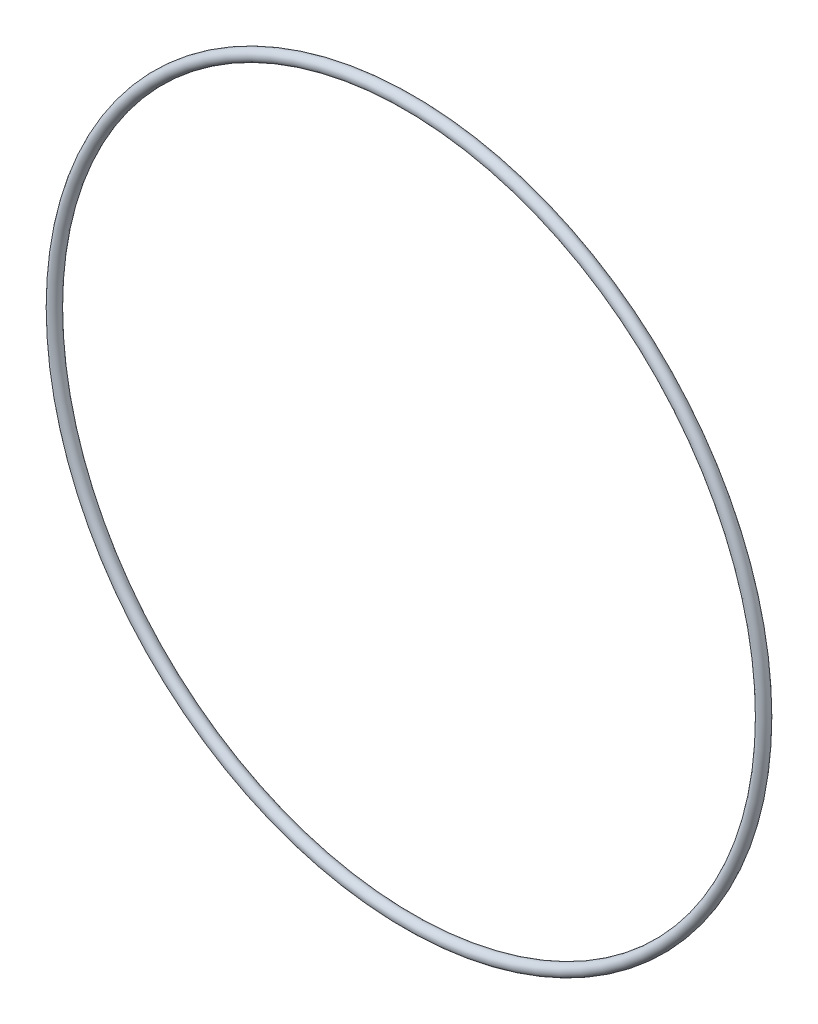
ISO-10303-21;
HEADER;
FILE_DESCRIPTION(('STEP AP214'),'2;1');
FILE_NAME('part.step','',(''),(''),'','','');
FILE_SCHEMA(('AUTOMOTIVE_DESIGN { 1 0 10303 214 1 1 1 1 }'));
ENDSEC;
DATA;
#1=APPLICATION_CONTEXT('core data for automotive mechanical design processes');
#2=APPLICATION_PROTOCOL_DEFINITION('international standard','automotive_design',2000,#1);
#3=PRODUCT_CONTEXT('',#1,'mechanical');
#4=PRODUCT('Part','Part','',(#3));
#5=PRODUCT_RELATED_PRODUCT_CATEGORY('part','',(#4));
#6=PRODUCT_DEFINITION_FORMATION('','',#4);
#7=PRODUCT_DEFINITION_CONTEXT('part definition',#1,'design');
#8=PRODUCT_DEFINITION('design','',#6,#7);
#9=PRODUCT_DEFINITION_SHAPE('','',#8);
#10=(LENGTH_UNIT() NAMED_UNIT(*) SI_UNIT(.MILLI.,.METRE.));
#11=(NAMED_UNIT(*) PLANE_ANGLE_UNIT() SI_UNIT($,.RADIAN.));
#12=(NAMED_UNIT(*) SI_UNIT($,.STERADIAN.) SOLID_ANGLE_UNIT());
#13=UNCERTAINTY_MEASURE_WITH_UNIT(LENGTH_MEASURE(1.E-05),#10,'distance_accuracy_value','');
#14=(GEOMETRIC_REPRESENTATION_CONTEXT(3) GLOBAL_UNCERTAINTY_ASSIGNED_CONTEXT((#13)) GLOBAL_UNIT_ASSIGNED_CONTEXT((#10,
#11,#12)) REPRESENTATION_CONTEXT('',''));
#15=CARTESIAN_POINT('',(0.,0.,0.));
#16=DIRECTION('',(0.,0.,1.));
#17=DIRECTION('',(1.,0.,0.));
#18=AXIS2_PLACEMENT_3D('',#15,#16,#17);
#19=CARTESIAN_POINT('',(0.,0.,0.));
#20=DIRECTION('',(0.,0.,-1.));
#21=DIRECTION('',(-1.,0.,0.));
#22=AXIS2_PLACEMENT_3D('',#19,#20,#21);
#23=TOROIDAL_SURFACE('',#22,45.75,0.749999999999999);
#24=CARTESIAN_POINT('',(-46.5,0.,0.));
#25=VERTEX_POINT('',#24);
#26=VERTEX_LOOP('',#25);
#27=FACE_BOUND('',#26,.T.);
#28=ADVANCED_FACE('F28',(#27),#23,.T.);
#29=CLOSED_SHELL('',(#28));
#30=MANIFOLD_SOLID_BREP('B2',#29);
#31=ADVANCED_BREP_SHAPE_REPRESENTATION('',(#18,#30),#14);
#32=SHAPE_DEFINITION_REPRESENTATION(#9,#31);
ENDSEC;
END-ISO-10303-21;
